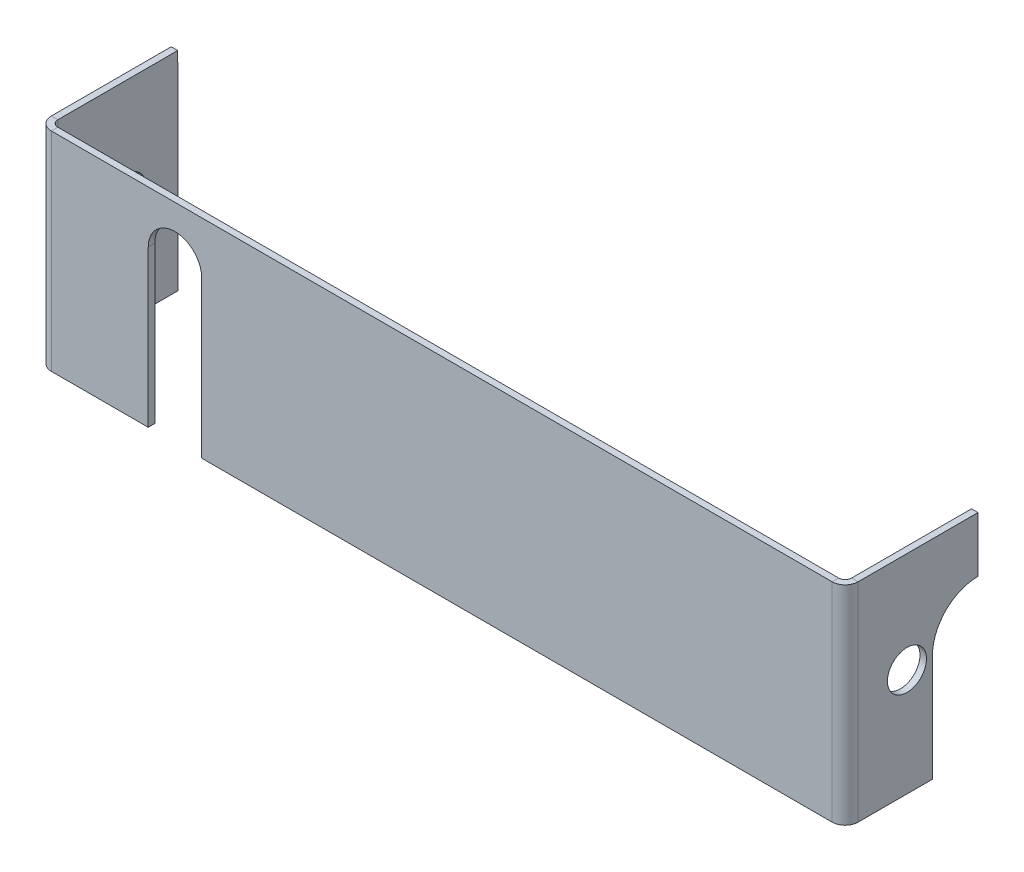
ISO-10303-21;
HEADER;
FILE_DESCRIPTION(('STEP AP214'),'2;1');
FILE_NAME('part.step','',(''),(''),'','','');
FILE_SCHEMA(('AUTOMOTIVE_DESIGN { 1 0 10303 214 1 1 1 1 }'));
ENDSEC;
DATA;
#1=APPLICATION_CONTEXT('core data for automotive mechanical design processes');
#2=APPLICATION_PROTOCOL_DEFINITION('international standard','automotive_design',2000,#1);
#3=PRODUCT_CONTEXT('',#1,'mechanical');
#4=PRODUCT('Part','Part','',(#3));
#5=PRODUCT_RELATED_PRODUCT_CATEGORY('part','',(#4));
#6=PRODUCT_DEFINITION_FORMATION('','',#4);
#7=PRODUCT_DEFINITION_CONTEXT('part definition',#1,'design');
#8=PRODUCT_DEFINITION('design','',#6,#7);
#9=PRODUCT_DEFINITION_SHAPE('','',#8);
#10=(LENGTH_UNIT() NAMED_UNIT(*) SI_UNIT(.MILLI.,.METRE.));
#11=(NAMED_UNIT(*) PLANE_ANGLE_UNIT() SI_UNIT($,.RADIAN.));
#12=(NAMED_UNIT(*) SI_UNIT($,.STERADIAN.) SOLID_ANGLE_UNIT());
#13=UNCERTAINTY_MEASURE_WITH_UNIT(LENGTH_MEASURE(1.E-05),#10,'distance_accuracy_value','');
#14=(GEOMETRIC_REPRESENTATION_CONTEXT(3) GLOBAL_UNCERTAINTY_ASSIGNED_CONTEXT((#13)) GLOBAL_UNIT_ASSIGNED_CONTEXT((#10,
#11,#12)) REPRESENTATION_CONTEXT('',''));
#15=CARTESIAN_POINT('',(0.,0.,0.));
#16=DIRECTION('',(0.,0.,1.));
#17=DIRECTION('',(1.,0.,0.));
#18=AXIS2_PLACEMENT_3D('',#15,#16,#17);
#19=CARTESIAN_POINT('',(-58.4390862944158,0.,15.3064805414552));
#20=DIRECTION('',(0.,-1.,0.));
#21=DIRECTION('',(0.,0.,-1.));
#22=AXIS2_PLACEMENT_3D('',#19,#20,#21);
#23=PLANE('',#22);
#24=DIRECTION('',(0.,0.,1.));
#25=VECTOR('',#24,1.);
#26=CARTESIAN_POINT('',(-50.4934144991509,0.,6.30648054145518));
#27=LINE('',#26,#25);
#28=CARTESIAN_POINT('',(-50.4934144991509,0.,15.8064805414552));
#29=VERTEX_POINT('',#28);
#30=CARTESIAN_POINT('',(-50.4934144991509,0.,16.3064805414552));
#31=VERTEX_POINT('',#30);
#32=EDGE_CURVE('E183',#29,#31,#27,.T.);
#33=ORIENTED_EDGE('',*,*,#32,.T.);
#34=DIRECTION('',(1.,0.,0.));
#35=VECTOR('',#34,1.);
#36=CARTESIAN_POINT('',(-58.9390862944158,0.,16.3064805414552));
#37=LINE('',#36,#35);
#38=CARTESIAN_POINT('',(-57.9390862944158,0.,16.3064805414552));
#39=VERTEX_POINT('',#38);
#40=EDGE_CURVE('E292',#39,#31,#37,.T.);
#41=ORIENTED_EDGE('',*,*,#40,.F.);
#42=DIRECTION('',(0.,0.,-1.));
#43=VECTOR('',#42,1.);
#44=CARTESIAN_POINT('',(-57.9390862944158,0.,16.3064805414552));
#45=LINE('',#44,#43);
#46=CARTESIAN_POINT('',(-57.9390862944158,0.,15.8064805414552));
#47=VERTEX_POINT('',#46);
#48=EDGE_CURVE('E331',#39,#47,#45,.T.);
#49=ORIENTED_EDGE('',*,*,#48,.T.);
#50=DIRECTION('',(1.,0.,0.));
#51=VECTOR('',#50,1.);
#52=CARTESIAN_POINT('',(-58.9390862944158,0.,15.8064805414552));
#53=LINE('',#52,#51);
#54=EDGE_CURVE('E278',#47,#29,#53,.T.);
#55=ORIENTED_EDGE('',*,*,#54,.T.);
#56=EDGE_LOOP('',(#33,#41,#49,#55));
#57=FACE_BOUND('',#56,.T.);
#58=ADVANCED_FACE('F35',(#57),#23,.T.);
#59=CARTESIAN_POINT('',(-58.439086294416,16.,-3.69351945854482));
#60=DIRECTION('',(1.,0.,0.));
#61=DIRECTION('',(0.,0.,-1.));
#62=AXIS2_PLACEMENT_3D('',#59,#60,#61);
#63=PLANE('',#62);
#64=CARTESIAN_POINT('',(-58.4390862944159,8.25,10.0564805414552));
#65=DIRECTION('',(-1.,0.,0.));
#66=DIRECTION('',(0.,0.,1.));
#67=AXIS2_PLACEMENT_3D('',#64,#65,#66);
#68=CIRCLE('',#67,1.5);
#69=CARTESIAN_POINT('',(-58.4390862944159,8.25,11.5564805414552));
#70=VERTEX_POINT('',#69);
#71=EDGE_CURVE('E199',#70,#70,#68,.T.);
#72=ORIENTED_EDGE('',*,*,#71,.T.);
#73=EDGE_LOOP('',(#72));
#74=FACE_BOUND('',#73,.T.);
#75=DIRECTION('',(0.,0.,1.));
#76=VECTOR('',#75,1.);
#77=CARTESIAN_POINT('',(-58.439086294416,0.,-3.69351945854482));
#78=LINE('',#77,#76);
#79=CARTESIAN_POINT('',(-58.4390862944159,0.,6.05648054145518));
#80=VERTEX_POINT('',#79);
#81=CARTESIAN_POINT('',(-58.4390862944158,0.,15.3064805414552));
#82=VERTEX_POINT('',#81);
#83=EDGE_CURVE('E284',#80,#82,#78,.T.);
#84=ORIENTED_EDGE('',*,*,#83,.F.);
#85=DIRECTION('',(0.,0.999997086096706,0.002414083282759));
#86=VECTOR('',#85,1.);
#87=CARTESIAN_POINT('',(-58.4390862944159,16.,6.09510598653014));
#88=LINE('',#87,#86);
#89=CARTESIAN_POINT('',(-58.4390862944159,16.,6.09510598653014));
#90=VERTEX_POINT('',#89);
#91=EDGE_CURVE('E58',#80,#90,#88,.T.);
#92=ORIENTED_EDGE('',*,*,#91,.T.);
#93=DIRECTION('',(0.,0.,1.));
#94=VECTOR('',#93,1.);
#95=CARTESIAN_POINT('',(-58.439086294416,16.,-3.69351945854482));
#96=LINE('',#95,#94);
#97=CARTESIAN_POINT('',(-58.4390862944158,16.,15.3064805414552));
#98=VERTEX_POINT('',#97);
#99=EDGE_CURVE('E255',#90,#98,#96,.T.);
#100=ORIENTED_EDGE('',*,*,#99,.T.);
#101=DIRECTION('',(0.,-1.,0.));
#102=VECTOR('',#101,1.);
#103=CARTESIAN_POINT('',(-58.4390862944158,16.,15.3064805414552));
#104=LINE('',#103,#102);
#105=EDGE_CURVE('E307',#98,#82,#104,.T.);
#106=ORIENTED_EDGE('',*,*,#105,.T.);
#107=EDGE_LOOP('',(#84,#92,#100,#106));
#108=FACE_BOUND('',#107,.T.);
#109=ADVANCED_FACE('F373',(#74,#108),#63,.T.);
#110=CARTESIAN_POINT('',(-58.939086294416,16.,-3.69351945854482));
#111=DIRECTION('',(1.,0.,0.));
#112=DIRECTION('',(0.,0.,-1.));
#113=AXIS2_PLACEMENT_3D('',#110,#111,#112);
#114=PLANE('',#113);
#115=CARTESIAN_POINT('',(-58.9390862944159,8.25,10.0564805414552));
#116=DIRECTION('',(-1.,0.,0.));
#117=DIRECTION('',(0.,0.,1.));
#118=AXIS2_PLACEMENT_3D('',#115,#116,#117);
#119=CIRCLE('',#118,1.5);
#120=CARTESIAN_POINT('',(-58.9390862944159,8.25,11.5564805414552));
#121=VERTEX_POINT('',#120);
#122=EDGE_CURVE('E201',#121,#121,#119,.T.);
#123=ORIENTED_EDGE('',*,*,#122,.F.);
#124=EDGE_LOOP('',(#123));
#125=FACE_BOUND('',#124,.T.);
#126=DIRECTION('',(0.,0.999997086096706,0.002414083282759));
#127=VECTOR('',#126,1.);
#128=CARTESIAN_POINT('',(-58.9390862944159,16.,6.09510598653015));
#129=LINE('',#128,#127);
#130=CARTESIAN_POINT('',(-58.9390862944159,0.,6.05648054145519));
#131=VERTEX_POINT('',#130);
#132=CARTESIAN_POINT('',(-58.9390862944159,16.,6.09510598653015));
#133=VERTEX_POINT('',#132);
#134=EDGE_CURVE('E193',#131,#133,#129,.T.);
#135=ORIENTED_EDGE('',*,*,#134,.F.);
#136=DIRECTION('',(0.,0.,1.));
#137=VECTOR('',#136,1.);
#138=CARTESIAN_POINT('',(-58.939086294416,0.,-3.69351945854482));
#139=LINE('',#138,#137);
#140=CARTESIAN_POINT('',(-58.9390862944158,0.,15.3064805414552));
#141=VERTEX_POINT('',#140);
#142=EDGE_CURVE('E286',#131,#141,#139,.T.);
#143=ORIENTED_EDGE('',*,*,#142,.T.);
#144=DIRECTION('',(0.,-1.,0.));
#145=VECTOR('',#144,1.);
#146=CARTESIAN_POINT('',(-58.9390862944158,16.,15.3064805414552));
#147=LINE('',#146,#145);
#148=CARTESIAN_POINT('',(-58.9390862944158,16.,15.3064805414552));
#149=VERTEX_POINT('',#148);
#150=EDGE_CURVE('E304',#149,#141,#147,.T.);
#151=ORIENTED_EDGE('',*,*,#150,.F.);
#152=DIRECTION('',(0.,0.,1.));
#153=VECTOR('',#152,1.);
#154=CARTESIAN_POINT('',(-58.939086294416,16.,-3.69351945854482));
#155=LINE('',#154,#153);
#156=EDGE_CURVE('E257',#133,#149,#155,.T.);
#157=ORIENTED_EDGE('',*,*,#156,.F.);
#158=EDGE_LOOP('',(#135,#143,#151,#157));
#159=FACE_BOUND('',#158,.T.);
#160=ADVANCED_FACE('F381',(#125,#159),#114,.F.);
#161=CARTESIAN_POINT('',(-57.9390862944158,16.,15.8064805414552));
#162=DIRECTION('',(0.,1.,0.));
#163=DIRECTION('',(0.,0.,1.));
#164=AXIS2_PLACEMENT_3D('',#161,#162,#163);
#165=PLANE('',#164);
#166=ORIENTED_EDGE('',*,*,#99,.F.);
#167=DIRECTION('',(-1.,0.,0.));
#168=VECTOR('',#167,1.);
#169=CARTESIAN_POINT('',(-58.9390862944159,16.,6.09510598653015));
#170=LINE('',#169,#168);
#171=EDGE_CURVE('E195',#133,#90,#170,.F.);
#172=ORIENTED_EDGE('',*,*,#171,.F.);
#173=ORIENTED_EDGE('',*,*,#156,.T.);
#174=DIRECTION('',(1.,0.,0.));
#175=VECTOR('',#174,1.);
#176=CARTESIAN_POINT('',(-58.9390862944158,16.,15.3064805414552));
#177=LINE('',#176,#175);
#178=EDGE_CURVE('E11',#149,#98,#177,.T.);
#179=ORIENTED_EDGE('',*,*,#178,.T.);
#180=EDGE_LOOP('',(#166,#172,#173,#179));
#181=FACE_BOUND('',#180,.T.);
#182=ADVANCED_FACE('F377',(#181),#165,.T.);
#183=CARTESIAN_POINT('',(2.06091370558417,0.,15.3064805414552));
#184=DIRECTION('',(0.,1.,0.));
#185=DIRECTION('',(1.,0.,0.));
#186=AXIS2_PLACEMENT_3D('',#183,#184,#185);
#187=PLANE('',#186);
#188=DIRECTION('',(-1.,0.,0.));
#189=VECTOR('',#188,1.);
#190=CARTESIAN_POINT('',(-58.9390862944159,0.,6.05648054145519));
#191=LINE('',#190,#189);
#192=EDGE_CURVE('E197',#131,#80,#191,.F.);
#193=ORIENTED_EDGE('',*,*,#192,.T.);
#194=ORIENTED_EDGE('',*,*,#83,.T.);
#195=DIRECTION('',(-1.,0.,0.));
#196=VECTOR('',#195,1.);
#197=CARTESIAN_POINT('',(-58.4390862944158,0.,15.3064805414552));
#198=LINE('',#197,#196);
#199=EDGE_CURVE('E328',#82,#141,#198,.T.);
#200=ORIENTED_EDGE('',*,*,#199,.T.);
#201=ORIENTED_EDGE('',*,*,#142,.F.);
#202=EDGE_LOOP('',(#193,#194,#200,#201));
#203=FACE_BOUND('',#202,.T.);
#204=ADVANCED_FACE('F446',(#203),#187,.F.);
#205=CARTESIAN_POINT('',(-58.9390862944158,16.,15.3064805414552));
#206=DIRECTION('',(0.,1.,0.));
#207=DIRECTION('',(0.,0.,1.));
#208=AXIS2_PLACEMENT_3D('',#205,#206,#207);
#209=PLANE('',#208);
#210=ORIENTED_EDGE('',*,*,#178,.F.);
#211=CARTESIAN_POINT('',(-57.9390862944158,16.,15.3064805414552));
#212=DIRECTION('',(0.,-1.,0.));
#213=DIRECTION('',(0.,0.,-1.));
#214=AXIS2_PLACEMENT_3D('',#211,#212,#213);
#215=CIRCLE('',#214,1.);
#216=CARTESIAN_POINT('',(-57.9390862944158,16.,16.3064805414552));
#217=VERTEX_POINT('',#216);
#218=EDGE_CURVE('E259',#149,#217,#215,.F.);
#219=ORIENTED_EDGE('',*,*,#218,.T.);
#220=DIRECTION('',(0.,0.,1.));
#221=VECTOR('',#220,1.);
#222=CARTESIAN_POINT('',(-57.9390862944158,16.,15.8064805414552));
#223=LINE('',#222,#221);
#224=CARTESIAN_POINT('',(-57.9390862944158,16.,15.8064805414552));
#225=VERTEX_POINT('',#224);
#226=EDGE_CURVE('E43',#225,#217,#223,.T.);
#227=ORIENTED_EDGE('',*,*,#226,.F.);
#228=CARTESIAN_POINT('',(-57.9390862944158,16.,15.3064805414552));
#229=DIRECTION('',(0.,1.,0.));
#230=DIRECTION('',(1.,0.,0.));
#231=AXIS2_PLACEMENT_3D('',#228,#229,#230);
#232=CIRCLE('',#231,0.5);
#233=EDGE_CURVE('E252',#98,#225,#232,.T.);
#234=ORIENTED_EDGE('',*,*,#233,.F.);
#235=EDGE_LOOP('',(#210,#219,#227,#234));
#236=FACE_BOUND('',#235,.T.);
#237=ADVANCED_FACE('F37',(#236),#209,.T.);
#238=CARTESIAN_POINT('',(-57.9390862944158,0.,16.3064805414552));
#239=DIRECTION('',(0.,-1.,0.));
#240=DIRECTION('',(0.,0.,-1.));
#241=AXIS2_PLACEMENT_3D('',#238,#239,#240);
#242=PLANE('',#241);
#243=ORIENTED_EDGE('',*,*,#48,.F.);
#244=CARTESIAN_POINT('',(-57.9390862944158,0.,15.3064805414552));
#245=DIRECTION('',(0.,-1.,0.));
#246=DIRECTION('',(0.,0.,-1.));
#247=AXIS2_PLACEMENT_3D('',#244,#245,#246);
#248=CIRCLE('',#247,1.);
#249=EDGE_CURVE('E288',#141,#39,#248,.F.);
#250=ORIENTED_EDGE('',*,*,#249,.F.);
#251=ORIENTED_EDGE('',*,*,#199,.F.);
#252=CARTESIAN_POINT('',(-57.9390862944158,0.,15.3064805414552));
#253=DIRECTION('',(0.,1.,0.));
#254=DIRECTION('',(1.,0.,0.));
#255=AXIS2_PLACEMENT_3D('',#252,#253,#254);
#256=CIRCLE('',#255,0.5);
#257=EDGE_CURVE('E281',#82,#47,#256,.T.);
#258=ORIENTED_EDGE('',*,*,#257,.T.);
#259=EDGE_LOOP('',(#243,#250,#251,#258));
#260=FACE_BOUND('',#259,.T.);
#261=ADVANCED_FACE('F385',(#260),#242,.T.);
#262=DIRECTION('',(0.,0.,1.));
#263=VECTOR('',#262,1.);
#264=CARTESIAN_POINT('',(-46.3847580896808,0.,6.30648054145518));
#265=LINE('',#264,#263);
#266=CARTESIAN_POINT('',(-46.3847580896808,0.,15.8064805414552));
#267=VERTEX_POINT('',#266);
#268=CARTESIAN_POINT('',(-46.3847580896808,0.,16.3064805414552));
#269=VERTEX_POINT('',#268);
#270=EDGE_CURVE('E50',#267,#269,#265,.T.);
#271=ORIENTED_EDGE('',*,*,#270,.F.);
#272=CARTESIAN_POINT('',(2.06091370558417,0.,15.8064805414552));
#273=VERTEX_POINT('',#272);
#274=EDGE_CURVE('E277',#267,#273,#53,.T.);
#275=ORIENTED_EDGE('',*,*,#274,.T.);
#276=DIRECTION('',(0.,0.,1.));
#277=VECTOR('',#276,1.);
#278=CARTESIAN_POINT('',(2.06091370558417,0.,15.8064805414552));
#279=LINE('',#278,#277);
#280=CARTESIAN_POINT('',(2.06091370558417,0.,16.3064805414552));
#281=VERTEX_POINT('',#280);
#282=EDGE_CURVE('E319',#273,#281,#279,.T.);
#283=ORIENTED_EDGE('',*,*,#282,.T.);
#284=EDGE_CURVE('E291',#269,#281,#37,.T.);
#285=ORIENTED_EDGE('',*,*,#284,.F.);
#286=EDGE_LOOP('',(#271,#275,#283,#285));
#287=FACE_BOUND('',#286,.T.);
#288=ADVANCED_FACE('F390',(#287),#23,.T.);
#289=CARTESIAN_POINT('',(2.06091370558417,16.,16.3064805414552));
#290=DIRECTION('',(0.,1.,0.));
#291=DIRECTION('',(0.,0.,1.));
#292=AXIS2_PLACEMENT_3D('',#289,#290,#291);
#293=PLANE('',#292);
#294=DIRECTION('',(0.,0.,-1.));
#295=VECTOR('',#294,1.);
#296=CARTESIAN_POINT('',(2.06091370558417,16.,16.3064805414552));
#297=LINE('',#296,#295);
#298=CARTESIAN_POINT('',(2.06091370558417,16.,16.3064805414552));
#299=VERTEX_POINT('',#298);
#300=CARTESIAN_POINT('',(2.06091370558417,16.,15.8064805414552));
#301=VERTEX_POINT('',#300);
#302=EDGE_CURVE('E326',#299,#301,#297,.T.);
#303=ORIENTED_EDGE('',*,*,#302,.F.);
#304=CARTESIAN_POINT('',(2.06091370558417,16.,15.3064805414552));
#305=DIRECTION('',(0.,-1.,0.));
#306=DIRECTION('',(0.,0.,-1.));
#307=AXIS2_PLACEMENT_3D('',#304,#305,#306);
#308=CIRCLE('',#307,1.);
#309=CARTESIAN_POINT('',(3.06091370558417,16.,15.3064805414552));
#310=VERTEX_POINT('',#309);
#311=EDGE_CURVE('E265',#299,#310,#308,.F.);
#312=ORIENTED_EDGE('',*,*,#311,.T.);
#313=DIRECTION('',(1.,0.,0.));
#314=VECTOR('',#313,1.);
#315=CARTESIAN_POINT('',(2.56091370558417,16.,15.3064805414552));
#316=LINE('',#315,#314);
#317=CARTESIAN_POINT('',(2.56091370558417,16.,15.3064805414552));
#318=VERTEX_POINT('',#317);
#319=EDGE_CURVE('E324',#318,#310,#316,.T.);
#320=ORIENTED_EDGE('',*,*,#319,.F.);
#321=CARTESIAN_POINT('',(2.06091370558417,16.,15.3064805414552));
#322=DIRECTION('',(0.,1.,0.));
#323=DIRECTION('',(1.,0.,0.));
#324=AXIS2_PLACEMENT_3D('',#321,#322,#323);
#325=CIRCLE('',#324,0.5);
#326=EDGE_CURVE('E246',#301,#318,#325,.T.);
#327=ORIENTED_EDGE('',*,*,#326,.F.);
#328=EDGE_LOOP('',(#303,#312,#320,#327));
#329=FACE_BOUND('',#328,.T.);
#330=ADVANCED_FACE('F355',(#329),#293,.T.);
#331=CARTESIAN_POINT('',(2.56091370558417,16.,15.3064805414552));
#332=DIRECTION('',(0.,1.,0.));
#333=DIRECTION('',(0.,0.,1.));
#334=AXIS2_PLACEMENT_3D('',#331,#332,#333);
#335=PLANE('',#334);
#336=DIRECTION('',(1.,0.,0.));
#337=VECTOR('',#336,1.);
#338=CARTESIAN_POINT('',(-58.9390862944158,16.,16.3064805414552));
#339=LINE('',#338,#337);
#340=EDGE_CURVE('E262',#217,#299,#339,.T.);
#341=ORIENTED_EDGE('',*,*,#340,.T.);
#342=ORIENTED_EDGE('',*,*,#302,.T.);
#343=DIRECTION('',(1.,0.,0.));
#344=VECTOR('',#343,1.);
#345=CARTESIAN_POINT('',(-58.9390862944158,16.,15.8064805414552));
#346=LINE('',#345,#344);
#347=EDGE_CURVE('E249',#225,#301,#346,.T.);
#348=ORIENTED_EDGE('',*,*,#347,.F.);
#349=ORIENTED_EDGE('',*,*,#226,.T.);
#350=EDGE_LOOP('',(#341,#342,#348,#349));
#351=FACE_BOUND('',#350,.T.);
#352=ADVANCED_FACE('F334',(#351),#335,.T.);
#353=CARTESIAN_POINT('',(3.06091370558417,0.,15.3064805414552));
#354=DIRECTION('',(0.,-1.,0.));
#355=DIRECTION('',(0.,0.,-1.));
#356=AXIS2_PLACEMENT_3D('',#353,#354,#355);
#357=PLANE('',#356);
#358=DIRECTION('',(-1.,0.,0.));
#359=VECTOR('',#358,1.);
#360=CARTESIAN_POINT('',(3.06091370558417,0.,15.3064805414552));
#361=LINE('',#360,#359);
#362=CARTESIAN_POINT('',(3.06091370558417,0.,15.3064805414552));
#363=VERTEX_POINT('',#362);
#364=CARTESIAN_POINT('',(2.56091370558417,0.,15.3064805414552));
#365=VERTEX_POINT('',#364);
#366=EDGE_CURVE('E322',#363,#365,#361,.T.);
#367=ORIENTED_EDGE('',*,*,#366,.F.);
#368=CARTESIAN_POINT('',(2.06091370558417,0.,15.3064805414552));
#369=DIRECTION('',(0.,-1.,0.));
#370=DIRECTION('',(0.,0.,-1.));
#371=AXIS2_PLACEMENT_3D('',#368,#369,#370);
#372=CIRCLE('',#371,1.);
#373=EDGE_CURVE('E243',#281,#363,#372,.F.);
#374=ORIENTED_EDGE('',*,*,#373,.F.);
#375=ORIENTED_EDGE('',*,*,#282,.F.);
#376=CARTESIAN_POINT('',(2.06091370558417,0.,15.3064805414552));
#377=DIRECTION('',(0.,1.,0.));
#378=DIRECTION('',(1.,0.,0.));
#379=AXIS2_PLACEMENT_3D('',#376,#377,#378);
#380=CIRCLE('',#379,0.5);
#381=EDGE_CURVE('E274',#273,#365,#380,.T.);
#382=ORIENTED_EDGE('',*,*,#381,.T.);
#383=EDGE_LOOP('',(#367,#374,#375,#382));
#384=FACE_BOUND('',#383,.T.);
#385=ADVANCED_FACE('F393',(#384),#357,.T.);
#386=CARTESIAN_POINT('',(2.06091370558417,0.,15.8064805414552));
#387=DIRECTION('',(0.,-1.,0.));
#388=DIRECTION('',(0.,0.,-1.));
#389=AXIS2_PLACEMENT_3D('',#386,#387,#388);
#390=PLANE('',#389);
#391=DIRECTION('',(1.,0.,0.));
#392=VECTOR('',#391,1.);
#393=CARTESIAN_POINT('',(2.56091370558417,0.,9.59510598652942));
#394=LINE('',#393,#392);
#395=CARTESIAN_POINT('',(2.56091370558417,0.,9.59510598652942));
#396=VERTEX_POINT('',#395);
#397=CARTESIAN_POINT('',(3.06091370558417,0.,9.59510598652942));
#398=VERTEX_POINT('',#397);
#399=EDGE_CURVE('E229',#396,#398,#394,.T.);
#400=ORIENTED_EDGE('',*,*,#399,.T.);
#401=DIRECTION('',(0.,0.,-1.));
#402=VECTOR('',#401,1.);
#403=CARTESIAN_POINT('',(3.06091370558417,0.,16.3064805414552));
#404=LINE('',#403,#402);
#405=EDGE_CURVE('E236',#363,#398,#404,.T.);
#406=ORIENTED_EDGE('',*,*,#405,.F.);
#407=ORIENTED_EDGE('',*,*,#366,.T.);
#408=DIRECTION('',(0.,0.,-1.));
#409=VECTOR('',#408,1.);
#410=CARTESIAN_POINT('',(2.56091370558417,0.,16.3064805414552));
#411=LINE('',#410,#409);
#412=EDGE_CURVE('E271',#365,#396,#411,.T.);
#413=ORIENTED_EDGE('',*,*,#412,.T.);
#414=EDGE_LOOP('',(#400,#406,#407,#413));
#415=FACE_BOUND('',#414,.T.);
#416=ADVANCED_FACE('F401',(#415),#390,.T.);
#417=CARTESIAN_POINT('',(3.06091370558417,16.,16.3064805414552));
#418=DIRECTION('',(-1.,0.,0.));
#419=DIRECTION('',(0.,0.,1.));
#420=AXIS2_PLACEMENT_3D('',#417,#418,#419);
#421=PLANE('',#420);
#422=CARTESIAN_POINT('',(3.06091370558417,8.25,11.5551059865294));
#423=DIRECTION('',(1.,0.,0.));
#424=DIRECTION('',(0.,0.,-1.));
#425=AXIS2_PLACEMENT_3D('',#422,#423,#424);
#426=CIRCLE('',#425,1.5);
#427=CARTESIAN_POINT('',(3.06091370558417,8.25,10.0551059865294));
#428=VERTEX_POINT('',#427);
#429=EDGE_CURVE('E226',#428,#428,#426,.T.);
#430=ORIENTED_EDGE('',*,*,#429,.F.);
#431=EDGE_LOOP('',(#430));
#432=FACE_BOUND('',#431,.T.);
#433=CARTESIAN_POINT('',(3.06091370558417,8.25,6.09510598652942));
#434=DIRECTION('',(1.,0.,0.));
#435=DIRECTION('',(0.,0.,-1.));
#436=AXIS2_PLACEMENT_3D('',#433,#434,#435);
#437=CIRCLE('',#436,3.5);
#438=CARTESIAN_POINT('',(3.06091370558417,11.75,6.09510598652942));
#439=VERTEX_POINT('',#438);
#440=CARTESIAN_POINT('',(3.06091370558417,8.25,9.59510598652942));
#441=VERTEX_POINT('',#440);
#442=EDGE_CURVE('E204',#439,#441,#437,.T.);
#443=ORIENTED_EDGE('',*,*,#442,.F.);
#444=DIRECTION('',(0.,-1.,0.));
#445=VECTOR('',#444,1.);
#446=CARTESIAN_POINT('',(3.06091370558417,16.,6.09510598652942));
#447=LINE('',#446,#445);
#448=CARTESIAN_POINT('',(3.06091370558417,16.,6.09510598652942));
#449=VERTEX_POINT('',#448);
#450=EDGE_CURVE('E211',#449,#439,#447,.T.);
#451=ORIENTED_EDGE('',*,*,#450,.F.);
#452=DIRECTION('',(0.,0.,-1.));
#453=VECTOR('',#452,1.);
#454=CARTESIAN_POINT('',(3.06091370558417,16.,16.3064805414552));
#455=LINE('',#454,#453);
#456=EDGE_CURVE('E239',#310,#449,#455,.T.);
#457=ORIENTED_EDGE('',*,*,#456,.F.);
#458=DIRECTION('',(0.,-1.,0.));
#459=VECTOR('',#458,1.);
#460=CARTESIAN_POINT('',(3.06091370558417,16.,15.3064805414552));
#461=LINE('',#460,#459);
#462=EDGE_CURVE('E268',#310,#363,#461,.T.);
#463=ORIENTED_EDGE('',*,*,#462,.T.);
#464=ORIENTED_EDGE('',*,*,#405,.T.);
#465=DIRECTION('',(0.,-1.,0.));
#466=VECTOR('',#465,1.);
#467=CARTESIAN_POINT('',(3.06091370558417,8.25,9.59510598652942));
#468=LINE('',#467,#466);
#469=EDGE_CURVE('E220',#441,#398,#468,.T.);
#470=ORIENTED_EDGE('',*,*,#469,.F.);
#471=EDGE_LOOP('',(#443,#451,#457,#463,#464,#470));
#472=FACE_BOUND('',#471,.T.);
#473=ADVANCED_FACE('F397',(#432,#472),#421,.F.);
#474=CARTESIAN_POINT('',(2.56091370558417,16.,16.3064805414552));
#475=DIRECTION('',(-1.,0.,0.));
#476=DIRECTION('',(0.,0.,1.));
#477=AXIS2_PLACEMENT_3D('',#474,#475,#476);
#478=PLANE('',#477);
#479=DIRECTION('',(0.,-1.,0.));
#480=VECTOR('',#479,1.);
#481=CARTESIAN_POINT('',(2.56091370558417,16.,6.09510598652942));
#482=LINE('',#481,#480);
#483=CARTESIAN_POINT('',(2.56091370558417,16.,6.09510598652942));
#484=VERTEX_POINT('',#483);
#485=CARTESIAN_POINT('',(2.56091370558417,11.75,6.09510598652942));
#486=VERTEX_POINT('',#485);
#487=EDGE_CURVE('E214',#484,#486,#482,.T.);
#488=ORIENTED_EDGE('',*,*,#487,.T.);
#489=CARTESIAN_POINT('',(2.56091370558417,8.25,6.09510598652942));
#490=DIRECTION('',(1.,0.,0.));
#491=DIRECTION('',(0.,0.,-1.));
#492=AXIS2_PLACEMENT_3D('',#489,#490,#491);
#493=CIRCLE('',#492,3.5);
#494=CARTESIAN_POINT('',(2.56091370558417,8.25,9.59510598652942));
#495=VERTEX_POINT('',#494);
#496=EDGE_CURVE('E207',#486,#495,#493,.T.);
#497=ORIENTED_EDGE('',*,*,#496,.T.);
#498=DIRECTION('',(0.,-1.,0.));
#499=VECTOR('',#498,1.);
#500=CARTESIAN_POINT('',(2.56091370558417,8.25,9.59510598652942));
#501=LINE('',#500,#499);
#502=EDGE_CURVE('E210',#495,#396,#501,.T.);
#503=ORIENTED_EDGE('',*,*,#502,.T.);
#504=ORIENTED_EDGE('',*,*,#412,.F.);
#505=DIRECTION('',(0.,-1.,0.));
#506=VECTOR('',#505,1.);
#507=CARTESIAN_POINT('',(2.56091370558417,16.,15.3064805414552));
#508=LINE('',#507,#506);
#509=EDGE_CURVE('E316',#318,#365,#508,.T.);
#510=ORIENTED_EDGE('',*,*,#509,.F.);
#511=DIRECTION('',(0.,0.,-1.));
#512=VECTOR('',#511,1.);
#513=CARTESIAN_POINT('',(2.56091370558417,16.,16.3064805414552));
#514=LINE('',#513,#512);
#515=EDGE_CURVE('E242',#318,#484,#514,.T.);
#516=ORIENTED_EDGE('',*,*,#515,.T.);
#517=EDGE_LOOP('',(#488,#497,#503,#504,#510,#516));
#518=FACE_BOUND('',#517,.T.);
#519=CARTESIAN_POINT('',(2.56091370558417,8.25,11.5551059865294));
#520=DIRECTION('',(1.,0.,0.));
#521=DIRECTION('',(0.,0.,-1.));
#522=AXIS2_PLACEMENT_3D('',#519,#520,#521);
#523=CIRCLE('',#522,1.5);
#524=CARTESIAN_POINT('',(2.56091370558417,8.25,10.0551059865294));
#525=VERTEX_POINT('',#524);
#526=EDGE_CURVE('E233',#525,#525,#523,.T.);
#527=ORIENTED_EDGE('',*,*,#526,.T.);
#528=EDGE_LOOP('',(#527));
#529=FACE_BOUND('',#528,.T.);
#530=ADVANCED_FACE('F407',(#518,#529),#478,.T.);
#531=CARTESIAN_POINT('',(2.06091370558417,16.,15.3064805414552));
#532=DIRECTION('',(0.,-1.,0.));
#533=DIRECTION('',(0.,0.,-1.));
#534=AXIS2_PLACEMENT_3D('',#531,#532,#533);
#535=CYLINDRICAL_SURFACE('',#534,0.5);
#536=ORIENTED_EDGE('',*,*,#381,.F.);
#537=DIRECTION('',(0.,-1.,0.));
#538=VECTOR('',#537,1.);
#539=CARTESIAN_POINT('',(2.06091370558417,16.,15.8064805414552));
#540=LINE('',#539,#538);
#541=EDGE_CURVE('E313',#301,#273,#540,.T.);
#542=ORIENTED_EDGE('',*,*,#541,.F.);
#543=ORIENTED_EDGE('',*,*,#326,.T.);
#544=ORIENTED_EDGE('',*,*,#509,.T.);
#545=EDGE_LOOP('',(#536,#542,#543,#544));
#546=FACE_BOUND('',#545,.T.);
#547=ADVANCED_FACE('F361',(#546),#535,.F.);
#548=CARTESIAN_POINT('',(-58.9390862944158,16.,15.8064805414552));
#549=DIRECTION('',(0.,0.,-1.));
#550=DIRECTION('',(-1.,0.,0.));
#551=AXIS2_PLACEMENT_3D('',#548,#549,#550);
#552=PLANE('',#551);
#553=DIRECTION('',(0.,1.,0.));
#554=VECTOR('',#553,1.);
#555=CARTESIAN_POINT('',(-50.4934144991509,16.,15.8064805414552));
#556=LINE('',#555,#554);
#557=CARTESIAN_POINT('',(-50.4934144991509,12.,15.8064805414552));
#558=VERTEX_POINT('',#557);
#559=EDGE_CURVE('E191',#29,#558,#556,.T.);
#560=ORIENTED_EDGE('',*,*,#559,.F.);
#561=ORIENTED_EDGE('',*,*,#54,.F.);
#562=DIRECTION('',(0.,-1.,0.));
#563=VECTOR('',#562,1.);
#564=CARTESIAN_POINT('',(-57.9390862944158,16.,15.8064805414552));
#565=LINE('',#564,#563);
#566=EDGE_CURVE('E310',#225,#47,#565,.T.);
#567=ORIENTED_EDGE('',*,*,#566,.F.);
#568=ORIENTED_EDGE('',*,*,#347,.T.);
#569=ORIENTED_EDGE('',*,*,#541,.T.);
#570=ORIENTED_EDGE('',*,*,#274,.F.);
#571=DIRECTION('',(0.,-1.,0.));
#572=VECTOR('',#571,1.);
#573=CARTESIAN_POINT('',(-46.3847580896808,16.,15.8064805414552));
#574=LINE('',#573,#572);
#575=CARTESIAN_POINT('',(-46.3847580896808,12.,15.8064805414552));
#576=VERTEX_POINT('',#575);
#577=EDGE_CURVE('E186',#576,#267,#574,.T.);
#578=ORIENTED_EDGE('',*,*,#577,.F.);
#579=CARTESIAN_POINT('',(-48.4390862944158,12.,15.8064805414552));
#580=DIRECTION('',(0.,0.,-1.));
#581=DIRECTION('',(-1.,0.,0.));
#582=AXIS2_PLACEMENT_3D('',#579,#580,#581);
#583=CIRCLE('',#582,2.05432820473501);
#584=EDGE_CURVE('E168',#558,#576,#583,.T.);
#585=ORIENTED_EDGE('',*,*,#584,.F.);
#586=EDGE_LOOP('',(#560,#561,#567,#568,#569,#570,#578,#585));
#587=FACE_BOUND('',#586,.T.);
#588=ADVANCED_FACE('F365',(#587),#552,.T.);
#589=CARTESIAN_POINT('',(-57.9390862944158,16.,15.3064805414552));
#590=DIRECTION('',(0.,-1.,0.));
#591=DIRECTION('',(0.,0.,-1.));
#592=AXIS2_PLACEMENT_3D('',#589,#590,#591);
#593=CYLINDRICAL_SURFACE('',#592,0.5);
#594=ORIENTED_EDGE('',*,*,#257,.F.);
#595=ORIENTED_EDGE('',*,*,#105,.F.);
#596=ORIENTED_EDGE('',*,*,#233,.T.);
#597=ORIENTED_EDGE('',*,*,#566,.T.);
#598=EDGE_LOOP('',(#594,#595,#596,#597));
#599=FACE_BOUND('',#598,.T.);
#600=ADVANCED_FACE('F369',(#599),#593,.F.);
#601=CARTESIAN_POINT('',(-57.9390862944158,16.,15.3064805414552));
#602=DIRECTION('',(0.,-1.,0.));
#603=DIRECTION('',(0.,0.,-1.));
#604=AXIS2_PLACEMENT_3D('',#601,#602,#603);
#605=CYLINDRICAL_SURFACE('',#604,1.);
#606=ORIENTED_EDGE('',*,*,#249,.T.);
#607=DIRECTION('',(0.,-1.,0.));
#608=VECTOR('',#607,1.);
#609=CARTESIAN_POINT('',(-57.9390862944158,16.,16.3064805414552));
#610=LINE('',#609,#608);
#611=EDGE_CURVE('E301',#217,#39,#610,.T.);
#612=ORIENTED_EDGE('',*,*,#611,.F.);
#613=ORIENTED_EDGE('',*,*,#218,.F.);
#614=ORIENTED_EDGE('',*,*,#150,.T.);
#615=EDGE_LOOP('',(#606,#612,#613,#614));
#616=FACE_BOUND('',#615,.T.);
#617=ADVANCED_FACE('F345',(#616),#605,.T.);
#618=CARTESIAN_POINT('',(-58.9390862944158,16.,16.3064805414552));
#619=DIRECTION('',(0.,0.,-1.));
#620=DIRECTION('',(-1.,0.,0.));
#621=AXIS2_PLACEMENT_3D('',#618,#619,#620);
#622=PLANE('',#621);
#623=ORIENTED_EDGE('',*,*,#40,.T.);
#624=DIRECTION('',(0.,-1.,0.));
#625=VECTOR('',#624,1.);
#626=CARTESIAN_POINT('',(-50.4934144991509,3.81878610106591,16.3064805414552));
#627=LINE('',#626,#625);
#628=CARTESIAN_POINT('',(-50.4934144991509,12.,16.3064805414552));
#629=VERTEX_POINT('',#628);
#630=EDGE_CURVE('E179',#629,#31,#627,.T.);
#631=ORIENTED_EDGE('',*,*,#630,.F.);
#632=CARTESIAN_POINT('',(-48.4390862944158,12.,16.3064805414552));
#633=DIRECTION('',(0.,0.,1.));
#634=DIRECTION('',(1.,0.,0.));
#635=AXIS2_PLACEMENT_3D('',#632,#633,#634);
#636=CIRCLE('',#635,2.05432820473501);
#637=CARTESIAN_POINT('',(-46.3847580896808,12.,16.3064805414552));
#638=VERTEX_POINT('',#637);
#639=EDGE_CURVE('E165',#638,#629,#636,.T.);
#640=ORIENTED_EDGE('',*,*,#639,.F.);
#641=DIRECTION('',(0.,1.,0.));
#642=VECTOR('',#641,1.);
#643=CARTESIAN_POINT('',(-46.3847580896808,12.,16.3064805414552));
#644=LINE('',#643,#642);
#645=EDGE_CURVE('E172',#269,#638,#644,.T.);
#646=ORIENTED_EDGE('',*,*,#645,.F.);
#647=ORIENTED_EDGE('',*,*,#284,.T.);
#648=DIRECTION('',(0.,-1.,0.));
#649=VECTOR('',#648,1.);
#650=CARTESIAN_POINT('',(2.06091370558417,16.,16.3064805414552));
#651=LINE('',#650,#649);
#652=EDGE_CURVE('E298',#299,#281,#651,.T.);
#653=ORIENTED_EDGE('',*,*,#652,.F.);
#654=ORIENTED_EDGE('',*,*,#340,.F.);
#655=ORIENTED_EDGE('',*,*,#611,.T.);
#656=EDGE_LOOP('',(#623,#631,#640,#646,#647,#653,#654,#655));
#657=FACE_BOUND('',#656,.T.);
#658=ADVANCED_FACE('F178',(#657),#622,.F.);
#659=CARTESIAN_POINT('',(2.06091370558417,16.,15.3064805414552));
#660=DIRECTION('',(0.,-1.,0.));
#661=DIRECTION('',(0.,0.,-1.));
#662=AXIS2_PLACEMENT_3D('',#659,#660,#661);
#663=CYLINDRICAL_SURFACE('',#662,1.);
#664=ORIENTED_EDGE('',*,*,#373,.T.);
#665=ORIENTED_EDGE('',*,*,#462,.F.);
#666=ORIENTED_EDGE('',*,*,#311,.F.);
#667=ORIENTED_EDGE('',*,*,#652,.T.);
#668=EDGE_LOOP('',(#664,#665,#666,#667));
#669=FACE_BOUND('',#668,.T.);
#670=ADVANCED_FACE('F352',(#669),#663,.T.);
#671=CARTESIAN_POINT('',(2.06091370558417,16.,15.3064805414552));
#672=DIRECTION('',(0.,1.,0.));
#673=DIRECTION('',(1.,0.,0.));
#674=AXIS2_PLACEMENT_3D('',#671,#672,#673);
#675=PLANE('',#674);
#676=DIRECTION('',(1.,0.,0.));
#677=VECTOR('',#676,1.);
#678=CARTESIAN_POINT('',(2.56091370558417,16.,6.09510598652942));
#679=LINE('',#678,#677);
#680=EDGE_CURVE('E227',#484,#449,#679,.T.);
#681=ORIENTED_EDGE('',*,*,#680,.F.);
#682=ORIENTED_EDGE('',*,*,#515,.F.);
#683=ORIENTED_EDGE('',*,*,#319,.T.);
#684=ORIENTED_EDGE('',*,*,#456,.T.);
#685=EDGE_LOOP('',(#681,#682,#683,#684));
#686=FACE_BOUND('',#685,.T.);
#687=ADVANCED_FACE('F415',(#686),#675,.T.);
#688=CARTESIAN_POINT('',(2.56091370558417,8.25,11.5551059865294));
#689=DIRECTION('',(1.,0.,0.));
#690=DIRECTION('',(0.,0.,-1.));
#691=AXIS2_PLACEMENT_3D('',#688,#689,#690);
#692=CYLINDRICAL_SURFACE('',#691,1.5);
#693=ORIENTED_EDGE('',*,*,#526,.F.);
#694=EDGE_LOOP('',(#693));
#695=FACE_BOUND('',#694,.T.);
#696=ORIENTED_EDGE('',*,*,#429,.T.);
#697=EDGE_LOOP('',(#696));
#698=FACE_BOUND('',#697,.T.);
#699=ADVANCED_FACE('F426',(#695,#698),#692,.F.);
#700=CARTESIAN_POINT('',(2.56091370558417,8.25,6.09510598652942));
#701=DIRECTION('',(1.,0.,0.));
#702=DIRECTION('',(0.,0.,-1.));
#703=AXIS2_PLACEMENT_3D('',#700,#701,#702);
#704=CYLINDRICAL_SURFACE('',#703,3.5);
#705=ORIENTED_EDGE('',*,*,#442,.T.);
#706=DIRECTION('',(1.,0.,0.));
#707=VECTOR('',#706,1.);
#708=CARTESIAN_POINT('',(2.56091370558417,8.25,9.59510598652942));
#709=LINE('',#708,#707);
#710=EDGE_CURVE('E217',#495,#441,#709,.T.);
#711=ORIENTED_EDGE('',*,*,#710,.F.);
#712=ORIENTED_EDGE('',*,*,#496,.F.);
#713=DIRECTION('',(1.,0.,0.));
#714=VECTOR('',#713,1.);
#715=CARTESIAN_POINT('',(2.56091370558417,11.75,6.09510598652942));
#716=LINE('',#715,#714);
#717=EDGE_CURVE('E224',#486,#439,#716,.T.);
#718=ORIENTED_EDGE('',*,*,#717,.T.);
#719=EDGE_LOOP('',(#705,#711,#712,#718));
#720=FACE_BOUND('',#719,.T.);
#721=ADVANCED_FACE('F411',(#720),#704,.F.);
#722=CARTESIAN_POINT('',(2.56091370558417,16.,6.09510598652942));
#723=DIRECTION('',(0.,0.,1.));
#724=DIRECTION('',(1.,0.,0.));
#725=AXIS2_PLACEMENT_3D('',#722,#723,#724);
#726=PLANE('',#725);
#727=ORIENTED_EDGE('',*,*,#450,.T.);
#728=ORIENTED_EDGE('',*,*,#717,.F.);
#729=ORIENTED_EDGE('',*,*,#487,.F.);
#730=ORIENTED_EDGE('',*,*,#680,.T.);
#731=EDGE_LOOP('',(#727,#728,#729,#730));
#732=FACE_BOUND('',#731,.T.);
#733=ADVANCED_FACE('F417',(#732),#726,.F.);
#734=CARTESIAN_POINT('',(2.56091370558417,8.25,9.59510598652942));
#735=DIRECTION('',(0.,0.,1.));
#736=DIRECTION('',(1.,0.,0.));
#737=AXIS2_PLACEMENT_3D('',#734,#735,#736);
#738=PLANE('',#737);
#739=ORIENTED_EDGE('',*,*,#469,.T.);
#740=ORIENTED_EDGE('',*,*,#399,.F.);
#741=ORIENTED_EDGE('',*,*,#502,.F.);
#742=ORIENTED_EDGE('',*,*,#710,.T.);
#743=EDGE_LOOP('',(#739,#740,#741,#742));
#744=FACE_BOUND('',#743,.T.);
#745=ADVANCED_FACE('F405',(#744),#738,.F.);
#746=CARTESIAN_POINT('',(-58.4390862944159,8.25,10.0564805414552));
#747=DIRECTION('',(-1.,0.,0.));
#748=DIRECTION('',(0.,0.,1.));
#749=AXIS2_PLACEMENT_3D('',#746,#747,#748);
#750=CYLINDRICAL_SURFACE('',#749,1.5);
#751=ORIENTED_EDGE('',*,*,#122,.T.);
#752=EDGE_LOOP('',(#751));
#753=FACE_BOUND('',#752,.T.);
#754=ORIENTED_EDGE('',*,*,#71,.F.);
#755=EDGE_LOOP('',(#754));
#756=FACE_BOUND('',#755,.T.);
#757=ADVANCED_FACE('F424',(#753,#756),#750,.F.);
#758=CARTESIAN_POINT('',(-58.9390862944159,16.,6.09510598653015));
#759=DIRECTION('',(0.,0.002414083282759,-0.999997086096707));
#760=DIRECTION('',(0.,0.999997086096706,0.002414083282759));
#761=AXIS2_PLACEMENT_3D('',#758,#759,#760);
#762=PLANE('',#761);
#763=ORIENTED_EDGE('',*,*,#192,.F.);
#764=ORIENTED_EDGE('',*,*,#134,.T.);
#765=ORIENTED_EDGE('',*,*,#171,.T.);
#766=ORIENTED_EDGE('',*,*,#91,.F.);
#767=EDGE_LOOP('',(#763,#764,#765,#766));
#768=FACE_BOUND('',#767,.T.);
#769=ADVANCED_FACE('F588',(#768),#762,.T.);
#770=CARTESIAN_POINT('',(-50.4934144991509,3.81878610106591,6.30648054145518));
#771=DIRECTION('',(-1.,0.,0.));
#772=DIRECTION('',(0.,0.,1.));
#773=AXIS2_PLACEMENT_3D('',#770,#771,#772);
#774=PLANE('',#773);
#775=ORIENTED_EDGE('',*,*,#559,.T.);
#776=DIRECTION('',(0.,0.,1.));
#777=VECTOR('',#776,1.);
#778=CARTESIAN_POINT('',(-50.4934144991509,12.,6.30648054145518));
#779=LINE('',#778,#777);
#780=EDGE_CURVE('E170',#558,#629,#779,.T.);
#781=ORIENTED_EDGE('',*,*,#780,.T.);
#782=ORIENTED_EDGE('',*,*,#630,.T.);
#783=ORIENTED_EDGE('',*,*,#32,.F.);
#784=EDGE_LOOP('',(#775,#781,#782,#783));
#785=FACE_BOUND('',#784,.T.);
#786=ADVANCED_FACE('F388',(#785),#774,.F.);
#787=CARTESIAN_POINT('',(-48.4390862944158,12.,6.30648054145518));
#788=DIRECTION('',(0.,0.,1.));
#789=DIRECTION('',(1.,0.,0.));
#790=AXIS2_PLACEMENT_3D('',#787,#788,#789);
#791=CYLINDRICAL_SURFACE('',#790,2.05432820473501);
#792=ORIENTED_EDGE('',*,*,#584,.T.);
#793=DIRECTION('',(0.,0.,1.));
#794=VECTOR('',#793,1.);
#795=CARTESIAN_POINT('',(-46.3847580896808,12.,6.30648054145518));
#796=LINE('',#795,#794);
#797=EDGE_CURVE('E161',#576,#638,#796,.T.);
#798=ORIENTED_EDGE('',*,*,#797,.T.);
#799=ORIENTED_EDGE('',*,*,#639,.T.);
#800=ORIENTED_EDGE('',*,*,#780,.F.);
#801=EDGE_LOOP('',(#792,#798,#799,#800));
#802=FACE_BOUND('',#801,.T.);
#803=ADVANCED_FACE('F162',(#802),#791,.F.);
#804=CARTESIAN_POINT('',(-46.3847580896808,12.,6.30648054145518));
#805=DIRECTION('',(1.,0.,0.));
#806=DIRECTION('',(0.,0.,-1.));
#807=AXIS2_PLACEMENT_3D('',#804,#805,#806);
#808=PLANE('',#807);
#809=ORIENTED_EDGE('',*,*,#577,.T.);
#810=ORIENTED_EDGE('',*,*,#270,.T.);
#811=ORIENTED_EDGE('',*,*,#645,.T.);
#812=ORIENTED_EDGE('',*,*,#797,.F.);
#813=EDGE_LOOP('',(#809,#810,#811,#812));
#814=FACE_BOUND('',#813,.T.);
#815=ADVANCED_FACE('F173',(#814),#808,.F.);
#816=CLOSED_SHELL('',(#58,#109,#160,#182,#204,#237,#261,#288,#330,#352,#385,#416,#473,#530,#547,
#588,#600,#617,#658,#670,#687,#699,#721,#733,#745,#757,#769,#786,#803,#815));
#817=MANIFOLD_SOLID_BREP('B2',#816);
#818=ADVANCED_BREP_SHAPE_REPRESENTATION('',(#18,#817),#14);
#819=SHAPE_DEFINITION_REPRESENTATION(#9,#818);
ENDSEC;
END-ISO-10303-21;
